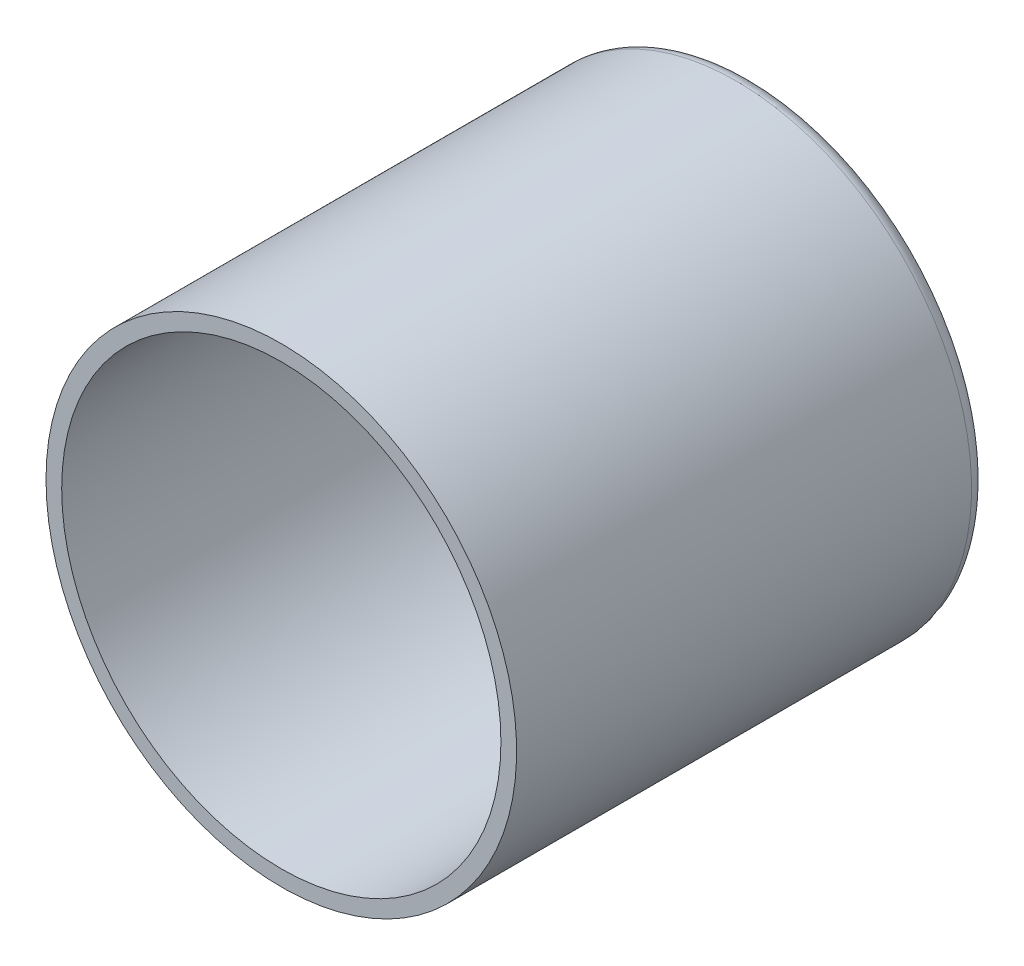
ISO-10303-21;
HEADER;
FILE_DESCRIPTION(('STEP AP214'),'2;1');
FILE_NAME('part.step','',(''),(''),'','','');
FILE_SCHEMA(('AUTOMOTIVE_DESIGN { 1 0 10303 214 1 1 1 1 }'));
ENDSEC;
DATA;
#1=APPLICATION_CONTEXT('core data for automotive mechanical design processes');
#2=APPLICATION_PROTOCOL_DEFINITION('international standard','automotive_design',2000,#1);
#3=PRODUCT_CONTEXT('',#1,'mechanical');
#4=PRODUCT('Part','Part','',(#3));
#5=PRODUCT_RELATED_PRODUCT_CATEGORY('part','',(#4));
#6=PRODUCT_DEFINITION_FORMATION('','',#4);
#7=PRODUCT_DEFINITION_CONTEXT('part definition',#1,'design');
#8=PRODUCT_DEFINITION('design','',#6,#7);
#9=PRODUCT_DEFINITION_SHAPE('','',#8);
#10=(LENGTH_UNIT() NAMED_UNIT(*) SI_UNIT(.MILLI.,.METRE.));
#11=(NAMED_UNIT(*) PLANE_ANGLE_UNIT() SI_UNIT($,.RADIAN.));
#12=(NAMED_UNIT(*) SI_UNIT($,.STERADIAN.) SOLID_ANGLE_UNIT());
#13=UNCERTAINTY_MEASURE_WITH_UNIT(LENGTH_MEASURE(1.E-05),#10,'distance_accuracy_value','');
#14=(GEOMETRIC_REPRESENTATION_CONTEXT(3) GLOBAL_UNCERTAINTY_ASSIGNED_CONTEXT((#13)) GLOBAL_UNIT_ASSIGNED_CONTEXT((#10,
#11,#12)) REPRESENTATION_CONTEXT('',''));
#15=CARTESIAN_POINT('',(0.,0.,0.));
#16=DIRECTION('',(0.,0.,1.));
#17=DIRECTION('',(1.,0.,0.));
#18=AXIS2_PLACEMENT_3D('',#15,#16,#17);
#19=CARTESIAN_POINT('',(247.392884643449,99.0117521958972,155.217225364224));
#20=DIRECTION('',(0.,0.,1.));
#21=DIRECTION('',(1.,0.,0.));
#22=AXIS2_PLACEMENT_3D('',#19,#20,#21);
#23=CYLINDRICAL_SURFACE('',#22,7.5);
#24=CARTESIAN_POINT('',(247.392884643449,99.0117521958972,155.717225364224));
#25=DIRECTION('',(0.,0.,-1.));
#26=DIRECTION('',(-1.,0.,0.));
#27=AXIS2_PLACEMENT_3D('',#24,#25,#26);
#28=CIRCLE('',#27,7.5);
#29=CARTESIAN_POINT('',(239.892884643449,99.0117521958972,155.717225364224));
#30=VERTEX_POINT('',#29);
#31=EDGE_CURVE('E10',#30,#30,#28,.F.);
#32=ORIENTED_EDGE('',*,*,#31,.T.);
#33=EDGE_LOOP('',(#32));
#34=FACE_BOUND('',#33,.T.);
#35=CARTESIAN_POINT('',(247.392884643449,99.0117521958973,170.217225364224));
#36=DIRECTION('',(0.,0.,-1.));
#37=DIRECTION('',(-1.,0.,0.));
#38=AXIS2_PLACEMENT_3D('',#35,#36,#37);
#39=CIRCLE('',#38,7.5);
#40=CARTESIAN_POINT('',(239.892884643449,99.0117521958973,170.217225364224));
#41=VERTEX_POINT('',#40);
#42=EDGE_CURVE('E47',#41,#41,#39,.T.);
#43=ORIENTED_EDGE('',*,*,#42,.T.);
#44=EDGE_LOOP('',(#43));
#45=FACE_BOUND('',#44,.T.);
#46=ADVANCED_FACE('F34',(#34,#45),#23,.T.);
#47=CARTESIAN_POINT('',(247.392884643449,99.0117521958972,155.217225364224));
#48=DIRECTION('',(0.,0.,-1.));
#49=DIRECTION('',(-1.,0.,0.));
#50=AXIS2_PLACEMENT_3D('',#47,#48,#49);
#51=PLANE('',#50);
#52=CARTESIAN_POINT('',(247.392884643449,99.0117521958972,155.217225364224));
#53=DIRECTION('',(0.,0.,-1.));
#54=DIRECTION('',(-1.,0.,0.));
#55=AXIS2_PLACEMENT_3D('',#52,#53,#54);
#56=CIRCLE('',#55,2.5);
#57=CARTESIAN_POINT('',(244.892884643449,99.0117521958972,155.217225364224));
#58=VERTEX_POINT('',#57);
#59=EDGE_CURVE('E356',#58,#58,#56,.T.);
#60=ORIENTED_EDGE('',*,*,#59,.F.);
#61=EDGE_LOOP('',(#60));
#62=FACE_BOUND('',#61,.T.);
#63=CARTESIAN_POINT('',(249.996187078154,93.6059389884827,155.217225364224));
#64=DIRECTION('',(0.,0.,-1.));
#65=DIRECTION('',(-1.,0.,0.));
#66=AXIS2_PLACEMENT_3D('',#63,#64,#65);
#67=CIRCLE('',#66,0.6);
#68=CARTESIAN_POINT('',(249.396187078154,93.6059389884827,155.217225364224));
#69=VERTEX_POINT('',#68);
#70=EDGE_CURVE('E377',#69,#69,#67,.T.);
#71=ORIENTED_EDGE('',*,*,#70,.F.);
#72=EDGE_LOOP('',(#71));
#73=FACE_BOUND('',#72,.T.);
#74=CARTESIAN_POINT('',(252.083873538257,95.2708133847449,155.217225364224));
#75=DIRECTION('',(0.,0.,-1.));
#76=DIRECTION('',(-1.,0.,0.));
#77=AXIS2_PLACEMENT_3D('',#74,#75,#76);
#78=CIRCLE('',#77,0.6);
#79=CARTESIAN_POINT('',(251.483873538257,95.2708133847449,155.217225364224));
#80=VERTEX_POINT('',#79);
#81=EDGE_CURVE('E380',#80,#80,#78,.T.);
#82=ORIENTED_EDGE('',*,*,#81,.F.);
#83=EDGE_LOOP('',(#82));
#84=FACE_BOUND('',#83,.T.);
#85=CARTESIAN_POINT('',(253.24245211654,97.6766265921594,155.217225364224));
#86=DIRECTION('',(0.,0.,-1.));
#87=DIRECTION('',(-1.,0.,0.));
#88=AXIS2_PLACEMENT_3D('',#85,#86,#87);
#89=CIRCLE('',#88,0.6);
#90=CARTESIAN_POINT('',(252.64245211654,97.6766265921594,155.217225364224));
#91=VERTEX_POINT('',#90);
#92=EDGE_CURVE('E383',#91,#91,#89,.T.);
#93=ORIENTED_EDGE('',*,*,#92,.F.);
#94=EDGE_LOOP('',(#93));
#95=FACE_BOUND('',#94,.T.);
#96=CARTESIAN_POINT('',(253.24245211654,100.346877799635,155.217225364224));
#97=DIRECTION('',(0.,0.,-1.));
#98=DIRECTION('',(-1.,0.,0.));
#99=AXIS2_PLACEMENT_3D('',#96,#97,#98);
#100=CIRCLE('',#99,0.6);
#101=CARTESIAN_POINT('',(252.64245211654,100.346877799635,155.217225364224));
#102=VERTEX_POINT('',#101);
#103=EDGE_CURVE('E386',#102,#102,#100,.T.);
#104=ORIENTED_EDGE('',*,*,#103,.F.);
#105=EDGE_LOOP('',(#104));
#106=FACE_BOUND('',#105,.T.);
#107=CARTESIAN_POINT('',(252.083873538257,102.75269100705,155.217225364224));
#108=DIRECTION('',(0.,0.,-1.));
#109=DIRECTION('',(-1.,0.,0.));
#110=AXIS2_PLACEMENT_3D('',#107,#108,#109);
#111=CIRCLE('',#110,0.6);
#112=CARTESIAN_POINT('',(251.483873538257,102.75269100705,155.217225364224));
#113=VERTEX_POINT('',#112);
#114=EDGE_CURVE('E389',#113,#113,#111,.T.);
#115=ORIENTED_EDGE('',*,*,#114,.F.);
#116=EDGE_LOOP('',(#115));
#117=FACE_BOUND('',#116,.T.);
#118=CARTESIAN_POINT('',(249.996187078154,104.417565403312,155.217225364224));
#119=DIRECTION('',(0.,0.,-1.));
#120=DIRECTION('',(-1.,0.,0.));
#121=AXIS2_PLACEMENT_3D('',#118,#119,#120);
#122=CIRCLE('',#121,0.6);
#123=CARTESIAN_POINT('',(249.396187078154,104.417565403312,155.217225364224));
#124=VERTEX_POINT('',#123);
#125=EDGE_CURVE('E392',#124,#124,#122,.T.);
#126=ORIENTED_EDGE('',*,*,#125,.F.);
#127=EDGE_LOOP('',(#126));
#128=FACE_BOUND('',#127,.T.);
#129=CARTESIAN_POINT('',(247.392884643449,105.011752195897,155.217225364224));
#130=DIRECTION('',(0.,0.,-1.));
#131=DIRECTION('',(-1.,0.,0.));
#132=AXIS2_PLACEMENT_3D('',#129,#130,#131);
#133=CIRCLE('',#132,0.6);
#134=CARTESIAN_POINT('',(246.792884643449,105.011752195897,155.217225364224));
#135=VERTEX_POINT('',#134);
#136=EDGE_CURVE('E395',#135,#135,#133,.T.);
#137=ORIENTED_EDGE('',*,*,#136,.F.);
#138=EDGE_LOOP('',(#137));
#139=FACE_BOUND('',#138,.T.);
#140=CARTESIAN_POINT('',(244.789582208743,104.417565403312,155.217225364224));
#141=DIRECTION('',(0.,0.,-1.));
#142=DIRECTION('',(-1.,0.,0.));
#143=AXIS2_PLACEMENT_3D('',#140,#141,#142);
#144=CIRCLE('',#143,0.6);
#145=CARTESIAN_POINT('',(244.189582208743,104.417565403312,155.217225364224));
#146=VERTEX_POINT('',#145);
#147=EDGE_CURVE('E368',#146,#146,#144,.T.);
#148=ORIENTED_EDGE('',*,*,#147,.F.);
#149=EDGE_LOOP('',(#148));
#150=FACE_BOUND('',#149,.T.);
#151=CARTESIAN_POINT('',(242.70189574864,102.75269100705,155.217225364224));
#152=DIRECTION('',(0.,0.,-1.));
#153=DIRECTION('',(-1.,0.,0.));
#154=AXIS2_PLACEMENT_3D('',#151,#152,#153);
#155=CIRCLE('',#154,0.6);
#156=CARTESIAN_POINT('',(242.10189574864,102.75269100705,155.217225364224));
#157=VERTEX_POINT('',#156);
#158=EDGE_CURVE('E365',#157,#157,#155,.T.);
#159=ORIENTED_EDGE('',*,*,#158,.F.);
#160=EDGE_LOOP('',(#159));
#161=FACE_BOUND('',#160,.T.);
#162=CARTESIAN_POINT('',(241.543317170358,100.346877799635,155.217225364224));
#163=DIRECTION('',(0.,0.,-1.));
#164=DIRECTION('',(-1.,0.,0.));
#165=AXIS2_PLACEMENT_3D('',#162,#163,#164);
#166=CIRCLE('',#165,0.6);
#167=CARTESIAN_POINT('',(240.943317170358,100.346877799635,155.217225364224));
#168=VERTEX_POINT('',#167);
#169=EDGE_CURVE('E369',#168,#168,#166,.T.);
#170=ORIENTED_EDGE('',*,*,#169,.F.);
#171=EDGE_LOOP('',(#170));
#172=FACE_BOUND('',#171,.T.);
#173=CARTESIAN_POINT('',(241.543317170358,97.6766265921593,155.217225364224));
#174=DIRECTION('',(0.,0.,-1.));
#175=DIRECTION('',(-1.,0.,0.));
#176=AXIS2_PLACEMENT_3D('',#173,#174,#175);
#177=CIRCLE('',#176,0.600000000000001);
#178=CARTESIAN_POINT('',(240.943317170358,97.6766265921593,155.217225364224));
#179=VERTEX_POINT('',#178);
#180=EDGE_CURVE('E372',#179,#179,#177,.T.);
#181=ORIENTED_EDGE('',*,*,#180,.F.);
#182=EDGE_LOOP('',(#181));
#183=FACE_BOUND('',#182,.T.);
#184=CARTESIAN_POINT('',(242.701895748641,95.2708133847447,155.217225364224));
#185=DIRECTION('',(0.,0.,-1.));
#186=DIRECTION('',(-1.,0.,0.));
#187=AXIS2_PLACEMENT_3D('',#184,#185,#186);
#188=CIRCLE('',#187,0.600000000000001);
#189=CARTESIAN_POINT('',(242.101895748641,95.2708133847447,155.217225364224));
#190=VERTEX_POINT('',#189);
#191=EDGE_CURVE('E362',#190,#190,#188,.T.);
#192=ORIENTED_EDGE('',*,*,#191,.F.);
#193=EDGE_LOOP('',(#192));
#194=FACE_BOUND('',#193,.T.);
#195=CARTESIAN_POINT('',(244.789582208743,93.6059389884827,155.217225364224));
#196=DIRECTION('',(0.,0.,-1.));
#197=DIRECTION('',(-1.,0.,0.));
#198=AXIS2_PLACEMENT_3D('',#195,#196,#197);
#199=CIRCLE('',#198,0.6);
#200=CARTESIAN_POINT('',(244.189582208743,93.6059389884827,155.217225364224));
#201=VERTEX_POINT('',#200);
#202=EDGE_CURVE('E359',#201,#201,#199,.T.);
#203=ORIENTED_EDGE('',*,*,#202,.F.);
#204=EDGE_LOOP('',(#203));
#205=FACE_BOUND('',#204,.T.);
#206=CARTESIAN_POINT('',(247.392884643449,93.0117521958972,155.217225364224));
#207=DIRECTION('',(0.,0.,-1.));
#208=DIRECTION('',(-1.,0.,0.));
#209=AXIS2_PLACEMENT_3D('',#206,#207,#208);
#210=CIRCLE('',#209,0.6);
#211=CARTESIAN_POINT('',(246.792884643449,93.0117521958972,155.217225364224));
#212=VERTEX_POINT('',#211);
#213=EDGE_CURVE('E55',#212,#212,#210,.T.);
#214=ORIENTED_EDGE('',*,*,#213,.F.);
#215=EDGE_LOOP('',(#214));
#216=FACE_BOUND('',#215,.T.);
#217=CARTESIAN_POINT('',(247.392884643449,99.0117521958972,155.217225364224));
#218=DIRECTION('',(0.,0.,-1.));
#219=DIRECTION('',(-1.,0.,0.));
#220=AXIS2_PLACEMENT_3D('',#217,#218,#219);
#221=CIRCLE('',#220,7.);
#222=CARTESIAN_POINT('',(240.392884643449,99.0117521958972,155.217225364224));
#223=VERTEX_POINT('',#222);
#224=EDGE_CURVE('E42',#223,#223,#221,.T.);
#225=ORIENTED_EDGE('',*,*,#224,.T.);
#226=EDGE_LOOP('',(#225));
#227=FACE_BOUND('',#226,.T.);
#228=ADVANCED_FACE('F109',(#62,#73,#84,#95,#106,#117,#128,#139,#150,#161,#172,#183,#194,#205,
#216,#227),#51,.T.);
#229=CARTESIAN_POINT('',(247.392884643449,99.0117521958973,170.217225364224));
#230=DIRECTION('',(0.,0.,-1.));
#231=DIRECTION('',(-1.,0.,0.));
#232=AXIS2_PLACEMENT_3D('',#229,#230,#231);
#233=PLANE('',#232);
#234=CARTESIAN_POINT('',(247.392884643449,99.0117521958973,170.217225364224));
#235=DIRECTION('',(0.,0.,-1.));
#236=DIRECTION('',(-1.,0.,0.));
#237=AXIS2_PLACEMENT_3D('',#234,#235,#236);
#238=CIRCLE('',#237,7.);
#239=CARTESIAN_POINT('',(240.392884643449,99.0117521958973,170.217225364224));
#240=VERTEX_POINT('',#239);
#241=EDGE_CURVE('E92',#240,#240,#238,.T.);
#242=ORIENTED_EDGE('',*,*,#241,.T.);
#243=EDGE_LOOP('',(#242));
#244=FACE_BOUND('',#243,.T.);
#245=ORIENTED_EDGE('',*,*,#42,.F.);
#246=EDGE_LOOP('',(#245));
#247=FACE_BOUND('',#246,.T.);
#248=ADVANCED_FACE('F107',(#244,#247),#233,.F.);
#249=CARTESIAN_POINT('',(247.392884643449,99.0117521958972,155.717225364224));
#250=DIRECTION('',(0.,0.,-1.));
#251=DIRECTION('',(-1.,0.,0.));
#252=AXIS2_PLACEMENT_3D('',#249,#250,#251);
#253=TOROIDAL_SURFACE('',#252,7.,0.5);
#254=ORIENTED_EDGE('',*,*,#31,.F.);
#255=EDGE_LOOP('',(#254));
#256=FACE_BOUND('',#255,.T.);
#257=ORIENTED_EDGE('',*,*,#224,.F.);
#258=EDGE_LOOP('',(#257));
#259=FACE_BOUND('',#258,.T.);
#260=ADVANCED_FACE('F36',(#256,#259),#253,.T.);
#261=CARTESIAN_POINT('',(247.392884643449,99.0117521958972,155.217225364224));
#262=DIRECTION('',(0.,0.,1.));
#263=DIRECTION('',(1.,0.,0.));
#264=AXIS2_PLACEMENT_3D('',#261,#262,#263);
#265=CYLINDRICAL_SURFACE('',#264,7.);
#266=CARTESIAN_POINT('',(247.392884643449,99.0117521958972,155.717225364224));
#267=DIRECTION('',(0.,0.,-1.));
#268=DIRECTION('',(-1.,0.,0.));
#269=AXIS2_PLACEMENT_3D('',#266,#267,#268);
#270=CIRCLE('',#269,7.);
#271=CARTESIAN_POINT('',(240.392884643449,99.0117521958972,155.717225364224));
#272=VERTEX_POINT('',#271);
#273=EDGE_CURVE('E96',#272,#272,#270,.T.);
#274=ORIENTED_EDGE('',*,*,#273,.T.);
#275=EDGE_LOOP('',(#274));
#276=FACE_BOUND('',#275,.T.);
#277=ORIENTED_EDGE('',*,*,#241,.F.);
#278=EDGE_LOOP('',(#277));
#279=FACE_BOUND('',#278,.T.);
#280=ADVANCED_FACE('F115',(#276,#279),#265,.F.);
#281=CARTESIAN_POINT('',(247.392884643449,99.0117521958972,155.717225364224));
#282=DIRECTION('',(0.,0.,-1.));
#283=DIRECTION('',(-1.,0.,0.));
#284=AXIS2_PLACEMENT_3D('',#281,#282,#283);
#285=PLANE('',#284);
#286=CARTESIAN_POINT('',(247.392884643449,99.0117521958972,155.717225364224));
#287=DIRECTION('',(0.,0.,-1.));
#288=DIRECTION('',(-1.,0.,0.));
#289=AXIS2_PLACEMENT_3D('',#286,#287,#288);
#290=CIRCLE('',#289,2.5);
#291=CARTESIAN_POINT('',(244.892884643449,99.0117521958972,155.717225364224));
#292=VERTEX_POINT('',#291);
#293=EDGE_CURVE('E38',#292,#292,#290,.T.);
#294=ORIENTED_EDGE('',*,*,#293,.T.);
#295=EDGE_LOOP('',(#294));
#296=FACE_BOUND('',#295,.T.);
#297=CARTESIAN_POINT('',(249.996187078154,93.6059389884827,155.717225364224));
#298=DIRECTION('',(0.,0.,-1.));
#299=DIRECTION('',(-1.,0.,0.));
#300=AXIS2_PLACEMENT_3D('',#297,#298,#299);
#301=CIRCLE('',#300,0.6);
#302=CARTESIAN_POINT('',(249.396187078154,93.6059389884827,155.717225364224));
#303=VERTEX_POINT('',#302);
#304=EDGE_CURVE('E90',#303,#303,#301,.T.);
#305=ORIENTED_EDGE('',*,*,#304,.T.);
#306=EDGE_LOOP('',(#305));
#307=FACE_BOUND('',#306,.T.);
#308=CARTESIAN_POINT('',(252.083873538257,95.2708133847449,155.717225364224));
#309=DIRECTION('',(0.,0.,-1.));
#310=DIRECTION('',(-1.,0.,0.));
#311=AXIS2_PLACEMENT_3D('',#308,#309,#310);
#312=CIRCLE('',#311,0.6);
#313=CARTESIAN_POINT('',(251.483873538257,95.2708133847449,155.717225364224));
#314=VERTEX_POINT('',#313);
#315=EDGE_CURVE('E88',#314,#314,#312,.T.);
#316=ORIENTED_EDGE('',*,*,#315,.T.);
#317=EDGE_LOOP('',(#316));
#318=FACE_BOUND('',#317,.T.);
#319=CARTESIAN_POINT('',(253.24245211654,97.6766265921594,155.717225364224));
#320=DIRECTION('',(0.,0.,-1.));
#321=DIRECTION('',(-1.,0.,0.));
#322=AXIS2_PLACEMENT_3D('',#319,#320,#321);
#323=CIRCLE('',#322,0.6);
#324=CARTESIAN_POINT('',(252.64245211654,97.6766265921594,155.717225364224));
#325=VERTEX_POINT('',#324);
#326=EDGE_CURVE('E85',#325,#325,#323,.T.);
#327=ORIENTED_EDGE('',*,*,#326,.T.);
#328=EDGE_LOOP('',(#327));
#329=FACE_BOUND('',#328,.T.);
#330=CARTESIAN_POINT('',(253.24245211654,100.346877799635,155.717225364224));
#331=DIRECTION('',(0.,0.,-1.));
#332=DIRECTION('',(-1.,0.,0.));
#333=AXIS2_PLACEMENT_3D('',#330,#331,#332);
#334=CIRCLE('',#333,0.6);
#335=CARTESIAN_POINT('',(252.64245211654,100.346877799635,155.717225364224));
#336=VERTEX_POINT('',#335);
#337=EDGE_CURVE('E82',#336,#336,#334,.T.);
#338=ORIENTED_EDGE('',*,*,#337,.T.);
#339=EDGE_LOOP('',(#338));
#340=FACE_BOUND('',#339,.T.);
#341=CARTESIAN_POINT('',(252.083873538257,102.75269100705,155.717225364224));
#342=DIRECTION('',(0.,0.,-1.));
#343=DIRECTION('',(-1.,0.,0.));
#344=AXIS2_PLACEMENT_3D('',#341,#342,#343);
#345=CIRCLE('',#344,0.6);
#346=CARTESIAN_POINT('',(251.483873538257,102.75269100705,155.717225364224));
#347=VERTEX_POINT('',#346);
#348=EDGE_CURVE('E79',#347,#347,#345,.T.);
#349=ORIENTED_EDGE('',*,*,#348,.T.);
#350=EDGE_LOOP('',(#349));
#351=FACE_BOUND('',#350,.T.);
#352=CARTESIAN_POINT('',(249.996187078154,104.417565403312,155.717225364224));
#353=DIRECTION('',(0.,0.,-1.));
#354=DIRECTION('',(-1.,0.,0.));
#355=AXIS2_PLACEMENT_3D('',#352,#353,#354);
#356=CIRCLE('',#355,0.6);
#357=CARTESIAN_POINT('',(249.396187078154,104.417565403312,155.717225364224));
#358=VERTEX_POINT('',#357);
#359=EDGE_CURVE('E76',#358,#358,#356,.T.);
#360=ORIENTED_EDGE('',*,*,#359,.T.);
#361=EDGE_LOOP('',(#360));
#362=FACE_BOUND('',#361,.T.);
#363=CARTESIAN_POINT('',(247.392884643449,105.011752195897,155.717225364224));
#364=DIRECTION('',(0.,0.,-1.));
#365=DIRECTION('',(-1.,0.,0.));
#366=AXIS2_PLACEMENT_3D('',#363,#364,#365);
#367=CIRCLE('',#366,0.6);
#368=CARTESIAN_POINT('',(246.792884643449,105.011752195897,155.717225364224));
#369=VERTEX_POINT('',#368);
#370=EDGE_CURVE('E73',#369,#369,#367,.T.);
#371=ORIENTED_EDGE('',*,*,#370,.T.);
#372=EDGE_LOOP('',(#371));
#373=FACE_BOUND('',#372,.T.);
#374=CARTESIAN_POINT('',(244.789582208743,104.417565403312,155.717225364224));
#375=DIRECTION('',(0.,0.,-1.));
#376=DIRECTION('',(-1.,0.,0.));
#377=AXIS2_PLACEMENT_3D('',#374,#375,#376);
#378=CIRCLE('',#377,0.6);
#379=CARTESIAN_POINT('',(244.189582208743,104.417565403312,155.717225364224));
#380=VERTEX_POINT('',#379);
#381=EDGE_CURVE('E70',#380,#380,#378,.T.);
#382=ORIENTED_EDGE('',*,*,#381,.T.);
#383=EDGE_LOOP('',(#382));
#384=FACE_BOUND('',#383,.T.);
#385=CARTESIAN_POINT('',(242.70189574864,102.75269100705,155.717225364224));
#386=DIRECTION('',(0.,0.,-1.));
#387=DIRECTION('',(-1.,0.,0.));
#388=AXIS2_PLACEMENT_3D('',#385,#386,#387);
#389=CIRCLE('',#388,0.6);
#390=CARTESIAN_POINT('',(242.10189574864,102.75269100705,155.717225364224));
#391=VERTEX_POINT('',#390);
#392=EDGE_CURVE('E67',#391,#391,#389,.T.);
#393=ORIENTED_EDGE('',*,*,#392,.T.);
#394=EDGE_LOOP('',(#393));
#395=FACE_BOUND('',#394,.T.);
#396=CARTESIAN_POINT('',(241.543317170358,100.346877799635,155.717225364224));
#397=DIRECTION('',(0.,0.,-1.));
#398=DIRECTION('',(-1.,0.,0.));
#399=AXIS2_PLACEMENT_3D('',#396,#397,#398);
#400=CIRCLE('',#399,0.6);
#401=CARTESIAN_POINT('',(240.943317170358,100.346877799635,155.717225364224));
#402=VERTEX_POINT('',#401);
#403=EDGE_CURVE('E64',#402,#402,#400,.T.);
#404=ORIENTED_EDGE('',*,*,#403,.T.);
#405=EDGE_LOOP('',(#404));
#406=FACE_BOUND('',#405,.T.);
#407=CARTESIAN_POINT('',(241.543317170358,97.6766265921593,155.717225364224));
#408=DIRECTION('',(0.,0.,-1.));
#409=DIRECTION('',(-1.,0.,0.));
#410=AXIS2_PLACEMENT_3D('',#407,#408,#409);
#411=CIRCLE('',#410,0.600000000000001);
#412=CARTESIAN_POINT('',(240.943317170358,97.6766265921593,155.717225364224));
#413=VERTEX_POINT('',#412);
#414=EDGE_CURVE('E61',#413,#413,#411,.T.);
#415=ORIENTED_EDGE('',*,*,#414,.T.);
#416=EDGE_LOOP('',(#415));
#417=FACE_BOUND('',#416,.T.);
#418=CARTESIAN_POINT('',(242.701895748641,95.2708133847447,155.717225364224));
#419=DIRECTION('',(0.,0.,-1.));
#420=DIRECTION('',(-1.,0.,0.));
#421=AXIS2_PLACEMENT_3D('',#418,#419,#420);
#422=CIRCLE('',#421,0.600000000000001);
#423=CARTESIAN_POINT('',(242.101895748641,95.2708133847447,155.717225364224));
#424=VERTEX_POINT('',#423);
#425=EDGE_CURVE('E58',#424,#424,#422,.T.);
#426=ORIENTED_EDGE('',*,*,#425,.T.);
#427=EDGE_LOOP('',(#426));
#428=FACE_BOUND('',#427,.T.);
#429=CARTESIAN_POINT('',(244.789582208743,93.6059389884827,155.717225364224));
#430=DIRECTION('',(0.,0.,-1.));
#431=DIRECTION('',(-1.,0.,0.));
#432=AXIS2_PLACEMENT_3D('',#429,#430,#431);
#433=CIRCLE('',#432,0.6);
#434=CARTESIAN_POINT('',(244.189582208743,93.6059389884827,155.717225364224));
#435=VERTEX_POINT('',#434);
#436=EDGE_CURVE('E54',#435,#435,#433,.T.);
#437=ORIENTED_EDGE('',*,*,#436,.T.);
#438=EDGE_LOOP('',(#437));
#439=FACE_BOUND('',#438,.T.);
#440=CARTESIAN_POINT('',(247.392884643449,93.0117521958972,155.717225364224));
#441=DIRECTION('',(0.,0.,-1.));
#442=DIRECTION('',(-1.,0.,0.));
#443=AXIS2_PLACEMENT_3D('',#440,#441,#442);
#444=CIRCLE('',#443,0.6);
#445=CARTESIAN_POINT('',(246.792884643449,93.0117521958972,155.717225364224));
#446=VERTEX_POINT('',#445);
#447=EDGE_CURVE('E51',#446,#446,#444,.T.);
#448=ORIENTED_EDGE('',*,*,#447,.T.);
#449=EDGE_LOOP('',(#448));
#450=FACE_BOUND('',#449,.T.);
#451=ORIENTED_EDGE('',*,*,#273,.F.);
#452=EDGE_LOOP('',(#451));
#453=FACE_BOUND('',#452,.T.);
#454=ADVANCED_FACE('F156',(#296,#307,#318,#329,#340,#351,#362,#373,#384,#395,#406,#417,#428,
#439,#450,#453),#285,.F.);
#455=CARTESIAN_POINT('',(247.392884643449,93.0117521958972,160.217225364224));
#456=DIRECTION('',(0.,0.,-1.));
#457=DIRECTION('',(-1.,0.,0.));
#458=AXIS2_PLACEMENT_3D('',#455,#456,#457);
#459=CYLINDRICAL_SURFACE('',#458,0.6);
#460=ORIENTED_EDGE('',*,*,#213,.T.);
#461=EDGE_LOOP('',(#460));
#462=FACE_BOUND('',#461,.T.);
#463=ORIENTED_EDGE('',*,*,#447,.F.);
#464=EDGE_LOOP('',(#463));
#465=FACE_BOUND('',#464,.T.);
#466=ADVANCED_FACE('F165',(#462,#465),#459,.F.);
#467=CARTESIAN_POINT('',(244.789582208743,93.6059389884827,160.217225364224));
#468=DIRECTION('',(0.,0.,-1.));
#469=DIRECTION('',(-1.,0.,0.));
#470=AXIS2_PLACEMENT_3D('',#467,#468,#469);
#471=CYLINDRICAL_SURFACE('',#470,0.6);
#472=ORIENTED_EDGE('',*,*,#202,.T.);
#473=EDGE_LOOP('',(#472));
#474=FACE_BOUND('',#473,.T.);
#475=ORIENTED_EDGE('',*,*,#436,.F.);
#476=EDGE_LOOP('',(#475));
#477=FACE_BOUND('',#476,.T.);
#478=ADVANCED_FACE('F175',(#474,#477),#471,.F.);
#479=CARTESIAN_POINT('',(242.701895748641,95.2708133847447,160.217225364224));
#480=DIRECTION('',(0.,0.,-1.));
#481=DIRECTION('',(-1.,0.,0.));
#482=AXIS2_PLACEMENT_3D('',#479,#480,#481);
#483=CYLINDRICAL_SURFACE('',#482,0.600000000000001);
#484=ORIENTED_EDGE('',*,*,#191,.T.);
#485=EDGE_LOOP('',(#484));
#486=FACE_BOUND('',#485,.T.);
#487=ORIENTED_EDGE('',*,*,#425,.F.);
#488=EDGE_LOOP('',(#487));
#489=FACE_BOUND('',#488,.T.);
#490=ADVANCED_FACE('F185',(#486,#489),#483,.F.);
#491=CARTESIAN_POINT('',(241.543317170358,97.6766265921593,160.217225364224));
#492=DIRECTION('',(0.,0.,-1.));
#493=DIRECTION('',(-1.,0.,0.));
#494=AXIS2_PLACEMENT_3D('',#491,#492,#493);
#495=CYLINDRICAL_SURFACE('',#494,0.600000000000001);
#496=ORIENTED_EDGE('',*,*,#180,.T.);
#497=EDGE_LOOP('',(#496));
#498=FACE_BOUND('',#497,.T.);
#499=ORIENTED_EDGE('',*,*,#414,.F.);
#500=EDGE_LOOP('',(#499));
#501=FACE_BOUND('',#500,.T.);
#502=ADVANCED_FACE('F195',(#498,#501),#495,.F.);
#503=CARTESIAN_POINT('',(241.543317170358,100.346877799635,160.217225364224));
#504=DIRECTION('',(0.,0.,-1.));
#505=DIRECTION('',(-1.,0.,0.));
#506=AXIS2_PLACEMENT_3D('',#503,#504,#505);
#507=CYLINDRICAL_SURFACE('',#506,0.6);
#508=ORIENTED_EDGE('',*,*,#169,.T.);
#509=EDGE_LOOP('',(#508));
#510=FACE_BOUND('',#509,.T.);
#511=ORIENTED_EDGE('',*,*,#403,.F.);
#512=EDGE_LOOP('',(#511));
#513=FACE_BOUND('',#512,.T.);
#514=ADVANCED_FACE('F205',(#510,#513),#507,.F.);
#515=CARTESIAN_POINT('',(242.70189574864,102.75269100705,160.217225364224));
#516=DIRECTION('',(0.,0.,-1.));
#517=DIRECTION('',(-1.,0.,0.));
#518=AXIS2_PLACEMENT_3D('',#515,#516,#517);
#519=CYLINDRICAL_SURFACE('',#518,0.6);
#520=ORIENTED_EDGE('',*,*,#158,.T.);
#521=EDGE_LOOP('',(#520));
#522=FACE_BOUND('',#521,.T.);
#523=ORIENTED_EDGE('',*,*,#392,.F.);
#524=EDGE_LOOP('',(#523));
#525=FACE_BOUND('',#524,.T.);
#526=ADVANCED_FACE('F215',(#522,#525),#519,.F.);
#527=CARTESIAN_POINT('',(244.789582208743,104.417565403312,160.217225364224));
#528=DIRECTION('',(0.,0.,-1.));
#529=DIRECTION('',(-1.,0.,0.));
#530=AXIS2_PLACEMENT_3D('',#527,#528,#529);
#531=CYLINDRICAL_SURFACE('',#530,0.6);
#532=ORIENTED_EDGE('',*,*,#147,.T.);
#533=EDGE_LOOP('',(#532));
#534=FACE_BOUND('',#533,.T.);
#535=ORIENTED_EDGE('',*,*,#381,.F.);
#536=EDGE_LOOP('',(#535));
#537=FACE_BOUND('',#536,.T.);
#538=ADVANCED_FACE('F225',(#534,#537),#531,.F.);
#539=CARTESIAN_POINT('',(247.392884643449,105.011752195897,160.217225364224));
#540=DIRECTION('',(0.,0.,-1.));
#541=DIRECTION('',(-1.,0.,0.));
#542=AXIS2_PLACEMENT_3D('',#539,#540,#541);
#543=CYLINDRICAL_SURFACE('',#542,0.6);
#544=ORIENTED_EDGE('',*,*,#136,.T.);
#545=EDGE_LOOP('',(#544));
#546=FACE_BOUND('',#545,.T.);
#547=ORIENTED_EDGE('',*,*,#370,.F.);
#548=EDGE_LOOP('',(#547));
#549=FACE_BOUND('',#548,.T.);
#550=ADVANCED_FACE('F235',(#546,#549),#543,.F.);
#551=CARTESIAN_POINT('',(249.996187078154,104.417565403312,160.217225364224));
#552=DIRECTION('',(0.,0.,-1.));
#553=DIRECTION('',(-1.,0.,0.));
#554=AXIS2_PLACEMENT_3D('',#551,#552,#553);
#555=CYLINDRICAL_SURFACE('',#554,0.6);
#556=ORIENTED_EDGE('',*,*,#125,.T.);
#557=EDGE_LOOP('',(#556));
#558=FACE_BOUND('',#557,.T.);
#559=ORIENTED_EDGE('',*,*,#359,.F.);
#560=EDGE_LOOP('',(#559));
#561=FACE_BOUND('',#560,.T.);
#562=ADVANCED_FACE('F245',(#558,#561),#555,.F.);
#563=CARTESIAN_POINT('',(252.083873538257,102.75269100705,160.217225364224));
#564=DIRECTION('',(0.,0.,-1.));
#565=DIRECTION('',(-1.,0.,0.));
#566=AXIS2_PLACEMENT_3D('',#563,#564,#565);
#567=CYLINDRICAL_SURFACE('',#566,0.6);
#568=ORIENTED_EDGE('',*,*,#114,.T.);
#569=EDGE_LOOP('',(#568));
#570=FACE_BOUND('',#569,.T.);
#571=ORIENTED_EDGE('',*,*,#348,.F.);
#572=EDGE_LOOP('',(#571));
#573=FACE_BOUND('',#572,.T.);
#574=ADVANCED_FACE('F255',(#570,#573),#567,.F.);
#575=CARTESIAN_POINT('',(253.24245211654,100.346877799635,160.217225364224));
#576=DIRECTION('',(0.,0.,-1.));
#577=DIRECTION('',(-1.,0.,0.));
#578=AXIS2_PLACEMENT_3D('',#575,#576,#577);
#579=CYLINDRICAL_SURFACE('',#578,0.6);
#580=ORIENTED_EDGE('',*,*,#103,.T.);
#581=EDGE_LOOP('',(#580));
#582=FACE_BOUND('',#581,.T.);
#583=ORIENTED_EDGE('',*,*,#337,.F.);
#584=EDGE_LOOP('',(#583));
#585=FACE_BOUND('',#584,.T.);
#586=ADVANCED_FACE('F265',(#582,#585),#579,.F.);
#587=CARTESIAN_POINT('',(253.24245211654,97.6766265921594,160.217225364224));
#588=DIRECTION('',(0.,0.,-1.));
#589=DIRECTION('',(-1.,0.,0.));
#590=AXIS2_PLACEMENT_3D('',#587,#588,#589);
#591=CYLINDRICAL_SURFACE('',#590,0.6);
#592=ORIENTED_EDGE('',*,*,#92,.T.);
#593=EDGE_LOOP('',(#592));
#594=FACE_BOUND('',#593,.T.);
#595=ORIENTED_EDGE('',*,*,#326,.F.);
#596=EDGE_LOOP('',(#595));
#597=FACE_BOUND('',#596,.T.);
#598=ADVANCED_FACE('F275',(#594,#597),#591,.F.);
#599=CARTESIAN_POINT('',(252.083873538257,95.2708133847449,160.217225364224));
#600=DIRECTION('',(0.,0.,-1.));
#601=DIRECTION('',(-1.,0.,0.));
#602=AXIS2_PLACEMENT_3D('',#599,#600,#601);
#603=CYLINDRICAL_SURFACE('',#602,0.6);
#604=ORIENTED_EDGE('',*,*,#81,.T.);
#605=EDGE_LOOP('',(#604));
#606=FACE_BOUND('',#605,.T.);
#607=ORIENTED_EDGE('',*,*,#315,.F.);
#608=EDGE_LOOP('',(#607));
#609=FACE_BOUND('',#608,.T.);
#610=ADVANCED_FACE('F285',(#606,#609),#603,.F.);
#611=CARTESIAN_POINT('',(249.996187078154,93.6059389884827,160.217225364224));
#612=DIRECTION('',(0.,0.,-1.));
#613=DIRECTION('',(-1.,0.,0.));
#614=AXIS2_PLACEMENT_3D('',#611,#612,#613);
#615=CYLINDRICAL_SURFACE('',#614,0.6);
#616=ORIENTED_EDGE('',*,*,#70,.T.);
#617=EDGE_LOOP('',(#616));
#618=FACE_BOUND('',#617,.T.);
#619=ORIENTED_EDGE('',*,*,#304,.F.);
#620=EDGE_LOOP('',(#619));
#621=FACE_BOUND('',#620,.T.);
#622=ADVANCED_FACE('F295',(#618,#621),#615,.F.);
#623=CARTESIAN_POINT('',(247.392884643449,99.0117521958972,165.217225364224));
#624=DIRECTION('',(0.,0.,-1.));
#625=DIRECTION('',(-1.,0.,0.));
#626=AXIS2_PLACEMENT_3D('',#623,#624,#625);
#627=CYLINDRICAL_SURFACE('',#626,2.5);
#628=ORIENTED_EDGE('',*,*,#59,.T.);
#629=EDGE_LOOP('',(#628));
#630=FACE_BOUND('',#629,.T.);
#631=ORIENTED_EDGE('',*,*,#293,.F.);
#632=EDGE_LOOP('',(#631));
#633=FACE_BOUND('',#632,.T.);
#634=ADVANCED_FACE('F305',(#630,#633),#627,.F.);
#635=CLOSED_SHELL('',(#46,#228,#248,#260,#280,#454,#466,#478,#490,#502,#514,#526,#538,#550,#562,
#574,#586,#598,#610,#622,#634));
#636=MANIFOLD_SOLID_BREP('B2',#635);
#637=ADVANCED_BREP_SHAPE_REPRESENTATION('',(#18,#636),#14);
#638=SHAPE_DEFINITION_REPRESENTATION(#9,#637);
ENDSEC;
END-ISO-10303-21;
